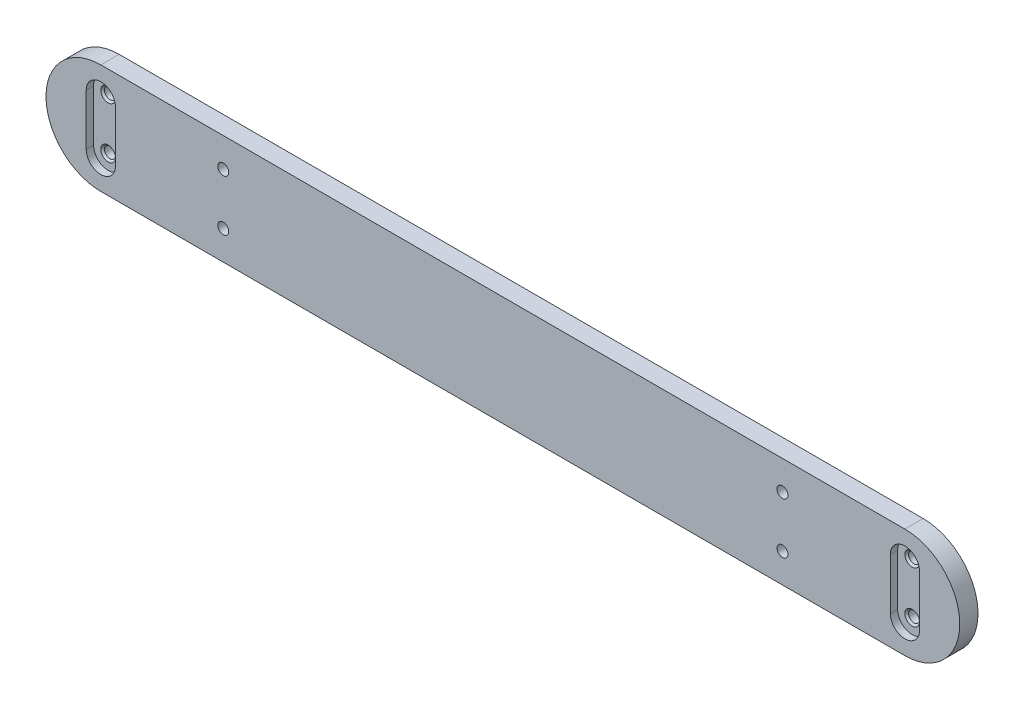
ISO-10303-21;
HEADER;
FILE_DESCRIPTION(('STEP AP214'),'2;1');
FILE_NAME('part.step','',(''),(''),'','','');
FILE_SCHEMA(('AUTOMOTIVE_DESIGN { 1 0 10303 214 1 1 1 1 }'));
ENDSEC;
DATA;
#1=APPLICATION_CONTEXT('core data for automotive mechanical design processes');
#2=APPLICATION_PROTOCOL_DEFINITION('international standard','automotive_design',2000,#1);
#3=PRODUCT_CONTEXT('',#1,'mechanical');
#4=PRODUCT('Part','Part','',(#3));
#5=PRODUCT_RELATED_PRODUCT_CATEGORY('part','',(#4));
#6=PRODUCT_DEFINITION_FORMATION('','',#4);
#7=PRODUCT_DEFINITION_CONTEXT('part definition',#1,'design');
#8=PRODUCT_DEFINITION('design','',#6,#7);
#9=PRODUCT_DEFINITION_SHAPE('','',#8);
#10=(LENGTH_UNIT() NAMED_UNIT(*) SI_UNIT(.MILLI.,.METRE.));
#11=(NAMED_UNIT(*) PLANE_ANGLE_UNIT() SI_UNIT($,.RADIAN.));
#12=(NAMED_UNIT(*) SI_UNIT($,.STERADIAN.) SOLID_ANGLE_UNIT());
#13=UNCERTAINTY_MEASURE_WITH_UNIT(LENGTH_MEASURE(1.E-05),#10,'distance_accuracy_value','');
#14=(GEOMETRIC_REPRESENTATION_CONTEXT(3) GLOBAL_UNCERTAINTY_ASSIGNED_CONTEXT((#13)) GLOBAL_UNIT_ASSIGNED_CONTEXT((#10,
#11,#12)) REPRESENTATION_CONTEXT('',''));
#15=CARTESIAN_POINT('',(0.,0.,0.));
#16=DIRECTION('',(0.,0.,1.));
#17=DIRECTION('',(1.,0.,0.));
#18=AXIS2_PLACEMENT_3D('',#15,#16,#17);
#19=CARTESIAN_POINT('',(-110.,0.,5.));
#20=DIRECTION('',(0.,0.,-1.));
#21=DIRECTION('',(-1.,0.,0.));
#22=AXIS2_PLACEMENT_3D('',#19,#20,#21);
#23=CYLINDRICAL_SURFACE('',#22,15.);
#24=CARTESIAN_POINT('',(-110.,0.,0.));
#25=DIRECTION('',(0.,0.,1.));
#26=DIRECTION('',(1.,0.,0.));
#27=AXIS2_PLACEMENT_3D('',#24,#25,#26);
#28=CIRCLE('',#27,15.);
#29=CARTESIAN_POINT('',(-110.,15.,0.));
#30=VERTEX_POINT('',#29);
#31=CARTESIAN_POINT('',(-110.,-15.,0.));
#32=VERTEX_POINT('',#31);
#33=EDGE_CURVE('E280',#30,#32,#28,.T.);
#34=ORIENTED_EDGE('',*,*,#33,.T.);
#35=DIRECTION('',(0.,0.,-1.));
#36=VECTOR('',#35,1.);
#37=CARTESIAN_POINT('',(-110.,-15.,5.));
#38=LINE('',#37,#36);
#39=CARTESIAN_POINT('',(-110.,-15.,5.));
#40=VERTEX_POINT('',#39);
#41=EDGE_CURVE('E343',#40,#32,#38,.T.);
#42=ORIENTED_EDGE('',*,*,#41,.F.);
#43=CARTESIAN_POINT('',(-110.,0.,5.));
#44=DIRECTION('',(0.,0.,1.));
#45=DIRECTION('',(1.,0.,0.));
#46=AXIS2_PLACEMENT_3D('',#43,#44,#45);
#47=CIRCLE('',#46,15.);
#48=CARTESIAN_POINT('',(-110.,15.,5.));
#49=VERTEX_POINT('',#48);
#50=EDGE_CURVE('E317',#49,#40,#47,.T.);
#51=ORIENTED_EDGE('',*,*,#50,.F.);
#52=DIRECTION('',(0.,0.,-1.));
#53=VECTOR('',#52,1.);
#54=CARTESIAN_POINT('',(-110.,15.,5.));
#55=LINE('',#54,#53);
#56=EDGE_CURVE('E327',#49,#30,#55,.T.);
#57=ORIENTED_EDGE('',*,*,#56,.T.);
#58=EDGE_LOOP('',(#34,#42,#51,#57));
#59=FACE_BOUND('',#58,.T.);
#60=ADVANCED_FACE('F43',(#59),#23,.T.);
#61=CARTESIAN_POINT('',(-110.,-15.,5.));
#62=DIRECTION('',(0.,1.,0.));
#63=DIRECTION('',(0.,0.,1.));
#64=AXIS2_PLACEMENT_3D('',#61,#62,#63);
#65=PLANE('',#64);
#66=DIRECTION('',(1.,0.,0.));
#67=VECTOR('',#66,1.);
#68=CARTESIAN_POINT('',(-110.,-15.,0.));
#69=LINE('',#68,#67);
#70=CARTESIAN_POINT('',(110.,-15.,0.));
#71=VERTEX_POINT('',#70);
#72=EDGE_CURVE('E330',#32,#71,#69,.T.);
#73=ORIENTED_EDGE('',*,*,#72,.T.);
#74=DIRECTION('',(0.,0.,-1.));
#75=VECTOR('',#74,1.);
#76=CARTESIAN_POINT('',(110.,-15.,5.));
#77=LINE('',#76,#75);
#78=CARTESIAN_POINT('',(110.,-15.,5.));
#79=VERTEX_POINT('',#78);
#80=EDGE_CURVE('E340',#79,#71,#77,.T.);
#81=ORIENTED_EDGE('',*,*,#80,.F.);
#82=DIRECTION('',(1.,0.,0.));
#83=VECTOR('',#82,1.);
#84=CARTESIAN_POINT('',(-110.,-15.,5.));
#85=LINE('',#84,#83);
#86=EDGE_CURVE('E320',#40,#79,#85,.T.);
#87=ORIENTED_EDGE('',*,*,#86,.F.);
#88=ORIENTED_EDGE('',*,*,#41,.T.);
#89=EDGE_LOOP('',(#73,#81,#87,#88));
#90=FACE_BOUND('',#89,.T.);
#91=ADVANCED_FACE('F443',(#90),#65,.F.);
#92=CARTESIAN_POINT('',(110.,0.,5.));
#93=DIRECTION('',(0.,0.,-1.));
#94=DIRECTION('',(-1.,0.,0.));
#95=AXIS2_PLACEMENT_3D('',#92,#93,#94);
#96=CYLINDRICAL_SURFACE('',#95,15.);
#97=CARTESIAN_POINT('',(110.,0.,0.));
#98=DIRECTION('',(0.,0.,1.));
#99=DIRECTION('',(1.,0.,0.));
#100=AXIS2_PLACEMENT_3D('',#97,#98,#99);
#101=CIRCLE('',#100,15.);
#102=CARTESIAN_POINT('',(110.,15.,0.));
#103=VERTEX_POINT('',#102);
#104=EDGE_CURVE('E332',#71,#103,#101,.T.);
#105=ORIENTED_EDGE('',*,*,#104,.T.);
#106=DIRECTION('',(0.,0.,-1.));
#107=VECTOR('',#106,1.);
#108=CARTESIAN_POINT('',(110.,15.,5.));
#109=LINE('',#108,#107);
#110=CARTESIAN_POINT('',(110.,15.,5.));
#111=VERTEX_POINT('',#110);
#112=EDGE_CURVE('E337',#111,#103,#109,.T.);
#113=ORIENTED_EDGE('',*,*,#112,.F.);
#114=CARTESIAN_POINT('',(110.,0.,5.));
#115=DIRECTION('',(0.,0.,1.));
#116=DIRECTION('',(1.,0.,0.));
#117=AXIS2_PLACEMENT_3D('',#114,#115,#116);
#118=CIRCLE('',#117,15.);
#119=EDGE_CURVE('E323',#79,#111,#118,.T.);
#120=ORIENTED_EDGE('',*,*,#119,.F.);
#121=ORIENTED_EDGE('',*,*,#80,.T.);
#122=EDGE_LOOP('',(#105,#113,#120,#121));
#123=FACE_BOUND('',#122,.T.);
#124=ADVANCED_FACE('F440',(#123),#96,.T.);
#125=CARTESIAN_POINT('',(-110.,15.,5.));
#126=DIRECTION('',(0.,-1.,0.));
#127=DIRECTION('',(0.,0.,-1.));
#128=AXIS2_PLACEMENT_3D('',#125,#126,#127);
#129=PLANE('',#128);
#130=DIRECTION('',(-1.,0.,0.));
#131=VECTOR('',#130,1.);
#132=CARTESIAN_POINT('',(-110.,15.,0.));
#133=LINE('',#132,#131);
#134=EDGE_CURVE('E321',#103,#30,#133,.T.);
#135=ORIENTED_EDGE('',*,*,#134,.T.);
#136=ORIENTED_EDGE('',*,*,#56,.F.);
#137=DIRECTION('',(-1.,0.,0.));
#138=VECTOR('',#137,1.);
#139=CARTESIAN_POINT('',(-110.,15.,5.));
#140=LINE('',#139,#138);
#141=EDGE_CURVE('E325',#111,#49,#140,.T.);
#142=ORIENTED_EDGE('',*,*,#141,.F.);
#143=ORIENTED_EDGE('',*,*,#112,.T.);
#144=EDGE_LOOP('',(#135,#136,#142,#143));
#145=FACE_BOUND('',#144,.T.);
#146=ADVANCED_FACE('F436',(#145),#129,.F.);
#147=CARTESIAN_POINT('',(-110.,0.,5.));
#148=DIRECTION('',(0.,0.,1.));
#149=DIRECTION('',(1.,0.,0.));
#150=AXIS2_PLACEMENT_3D('',#147,#148,#149);
#151=PLANE('',#150);
#152=CARTESIAN_POINT('',(-76.5,-7.,5.));
#153=DIRECTION('',(0.,0.,-1.));
#154=DIRECTION('',(1.,0.,0.));
#155=AXIS2_PLACEMENT_3D('',#152,#153,#154);
#156=CIRCLE('',#155,1.5);
#157=CARTESIAN_POINT('',(-75.,-7.,5.));
#158=VERTEX_POINT('',#157);
#159=EDGE_CURVE('E529',#158,#158,#156,.T.);
#160=ORIENTED_EDGE('',*,*,#159,.T.);
#161=EDGE_LOOP('',(#160));
#162=FACE_BOUND('',#161,.T.);
#163=CARTESIAN_POINT('',(76.5,7.,5.));
#164=DIRECTION('',(0.,0.,-1.));
#165=DIRECTION('',(1.,0.,0.));
#166=AXIS2_PLACEMENT_3D('',#163,#164,#165);
#167=CIRCLE('',#166,1.5);
#168=CARTESIAN_POINT('',(78.,7.,5.));
#169=VERTEX_POINT('',#168);
#170=EDGE_CURVE('E525',#169,#169,#167,.T.);
#171=ORIENTED_EDGE('',*,*,#170,.T.);
#172=EDGE_LOOP('',(#171));
#173=FACE_BOUND('',#172,.T.);
#174=CARTESIAN_POINT('',(76.5,-7.,5.));
#175=DIRECTION('',(0.,0.,-1.));
#176=DIRECTION('',(-1.,0.,0.));
#177=AXIS2_PLACEMENT_3D('',#174,#175,#176);
#178=CIRCLE('',#177,1.5);
#179=CARTESIAN_POINT('',(75.,-7.,5.));
#180=VERTEX_POINT('',#179);
#181=EDGE_CURVE('E523',#180,#180,#178,.T.);
#182=ORIENTED_EDGE('',*,*,#181,.T.);
#183=EDGE_LOOP('',(#182));
#184=FACE_BOUND('',#183,.T.);
#185=CARTESIAN_POINT('',(-76.5,7.,5.));
#186=DIRECTION('',(0.,0.,-1.));
#187=DIRECTION('',(-1.,0.,0.));
#188=AXIS2_PLACEMENT_3D('',#185,#186,#187);
#189=CIRCLE('',#188,1.5);
#190=CARTESIAN_POINT('',(-78.,7.,5.));
#191=VERTEX_POINT('',#190);
#192=EDGE_CURVE('E207',#191,#191,#189,.T.);
#193=ORIENTED_EDGE('',*,*,#192,.T.);
#194=EDGE_LOOP('',(#193));
#195=FACE_BOUND('',#194,.T.);
#196=CARTESIAN_POINT('',(110.,7.,5.));
#197=DIRECTION('',(0.,0.,1.));
#198=DIRECTION('',(1.,0.,0.));
#199=AXIS2_PLACEMENT_3D('',#196,#197,#198);
#200=CIRCLE('',#199,4.);
#201=CARTESIAN_POINT('',(114.,7.,5.));
#202=VERTEX_POINT('',#201);
#203=CARTESIAN_POINT('',(106.,7.,5.));
#204=VERTEX_POINT('',#203);
#205=EDGE_CURVE('E267',#202,#204,#200,.T.);
#206=ORIENTED_EDGE('',*,*,#205,.F.);
#207=DIRECTION('',(0.,1.,0.));
#208=VECTOR('',#207,1.);
#209=CARTESIAN_POINT('',(114.,7.,5.));
#210=LINE('',#209,#208);
#211=CARTESIAN_POINT('',(114.,-7.,5.));
#212=VERTEX_POINT('',#211);
#213=EDGE_CURVE('E257',#212,#202,#210,.T.);
#214=ORIENTED_EDGE('',*,*,#213,.F.);
#215=CARTESIAN_POINT('',(110.,-7.,5.));
#216=DIRECTION('',(0.,0.,1.));
#217=DIRECTION('',(1.,0.,0.));
#218=AXIS2_PLACEMENT_3D('',#215,#216,#217);
#219=CIRCLE('',#218,4.);
#220=CARTESIAN_POINT('',(106.,-7.,5.));
#221=VERTEX_POINT('',#220);
#222=EDGE_CURVE('E273',#221,#212,#219,.T.);
#223=ORIENTED_EDGE('',*,*,#222,.F.);
#224=DIRECTION('',(0.,-1.,0.));
#225=VECTOR('',#224,1.);
#226=CARTESIAN_POINT('',(106.,7.,5.));
#227=LINE('',#226,#225);
#228=EDGE_CURVE('E269',#204,#221,#227,.T.);
#229=ORIENTED_EDGE('',*,*,#228,.F.);
#230=EDGE_LOOP('',(#206,#214,#223,#229));
#231=FACE_BOUND('',#230,.T.);
#232=CARTESIAN_POINT('',(-110.,7.,5.));
#233=DIRECTION('',(0.,0.,1.));
#234=DIRECTION('',(1.,0.,0.));
#235=AXIS2_PLACEMENT_3D('',#232,#233,#234);
#236=CIRCLE('',#235,4.);
#237=CARTESIAN_POINT('',(-106.,7.,5.));
#238=VERTEX_POINT('',#237);
#239=CARTESIAN_POINT('',(-114.,7.,5.));
#240=VERTEX_POINT('',#239);
#241=EDGE_CURVE('E220',#238,#240,#236,.T.);
#242=ORIENTED_EDGE('',*,*,#241,.F.);
#243=DIRECTION('',(0.,1.,0.));
#244=VECTOR('',#243,1.);
#245=CARTESIAN_POINT('',(-106.,7.,5.));
#246=LINE('',#245,#244);
#247=CARTESIAN_POINT('',(-106.,-7.,5.));
#248=VERTEX_POINT('',#247);
#249=EDGE_CURVE('E291',#248,#238,#246,.T.);
#250=ORIENTED_EDGE('',*,*,#249,.F.);
#251=CARTESIAN_POINT('',(-110.,-7.,5.));
#252=DIRECTION('',(0.,0.,1.));
#253=DIRECTION('',(1.,0.,0.));
#254=AXIS2_PLACEMENT_3D('',#251,#252,#253);
#255=CIRCLE('',#254,4.);
#256=CARTESIAN_POINT('',(-114.,-7.,5.));
#257=VERTEX_POINT('',#256);
#258=EDGE_CURVE('E305',#257,#248,#255,.T.);
#259=ORIENTED_EDGE('',*,*,#258,.F.);
#260=DIRECTION('',(0.,-1.,0.));
#261=VECTOR('',#260,1.);
#262=CARTESIAN_POINT('',(-114.,7.,5.));
#263=LINE('',#262,#261);
#264=EDGE_CURVE('E302',#240,#257,#263,.T.);
#265=ORIENTED_EDGE('',*,*,#264,.F.);
#266=EDGE_LOOP('',(#242,#250,#259,#265));
#267=FACE_BOUND('',#266,.T.);
#268=ORIENTED_EDGE('',*,*,#50,.T.);
#269=ORIENTED_EDGE('',*,*,#86,.T.);
#270=ORIENTED_EDGE('',*,*,#119,.T.);
#271=ORIENTED_EDGE('',*,*,#141,.T.);
#272=EDGE_LOOP('',(#268,#269,#270,#271));
#273=FACE_BOUND('',#272,.T.);
#274=ADVANCED_FACE('F424',(#162,#173,#184,#195,#231,#267,#273),#151,.T.);
#275=CARTESIAN_POINT('',(-110.,0.,0.));
#276=DIRECTION('',(0.,0.,1.));
#277=DIRECTION('',(1.,0.,0.));
#278=AXIS2_PLACEMENT_3D('',#275,#276,#277);
#279=PLANE('',#278);
#280=CARTESIAN_POINT('',(110.,-7.,0.));
#281=DIRECTION('',(0.,0.,1.));
#282=DIRECTION('',(1.,0.,0.));
#283=AXIS2_PLACEMENT_3D('',#280,#281,#282);
#284=CIRCLE('',#283,1.5);
#285=CARTESIAN_POINT('',(111.5,-7.,0.));
#286=VERTEX_POINT('',#285);
#287=EDGE_CURVE('E531',#286,#286,#284,.T.);
#288=ORIENTED_EDGE('',*,*,#287,.T.);
#289=EDGE_LOOP('',(#288));
#290=FACE_BOUND('',#289,.T.);
#291=CARTESIAN_POINT('',(-110.,7.,0.));
#292=DIRECTION('',(0.,0.,1.));
#293=DIRECTION('',(1.,0.,0.));
#294=AXIS2_PLACEMENT_3D('',#291,#292,#293);
#295=CIRCLE('',#294,1.5);
#296=CARTESIAN_POINT('',(-108.5,7.,0.));
#297=VERTEX_POINT('',#296);
#298=EDGE_CURVE('E783',#297,#297,#295,.T.);
#299=ORIENTED_EDGE('',*,*,#298,.T.);
#300=EDGE_LOOP('',(#299));
#301=FACE_BOUND('',#300,.T.);
#302=CARTESIAN_POINT('',(-110.,-7.,0.));
#303=DIRECTION('',(0.,0.,1.));
#304=DIRECTION('',(1.,0.,0.));
#305=AXIS2_PLACEMENT_3D('',#302,#303,#304);
#306=CIRCLE('',#305,1.5);
#307=CARTESIAN_POINT('',(-108.5,-7.,0.));
#308=VERTEX_POINT('',#307);
#309=EDGE_CURVE('E785',#308,#308,#306,.T.);
#310=ORIENTED_EDGE('',*,*,#309,.T.);
#311=EDGE_LOOP('',(#310));
#312=FACE_BOUND('',#311,.T.);
#313=CARTESIAN_POINT('',(110.,7.,0.));
#314=DIRECTION('',(0.,0.,1.));
#315=DIRECTION('',(1.,0.,0.));
#316=AXIS2_PLACEMENT_3D('',#313,#314,#315);
#317=CIRCLE('',#316,1.5);
#318=CARTESIAN_POINT('',(111.5,7.,0.));
#319=VERTEX_POINT('',#318);
#320=EDGE_CURVE('E526',#319,#319,#317,.T.);
#321=ORIENTED_EDGE('',*,*,#320,.T.);
#322=EDGE_LOOP('',(#321));
#323=FACE_BOUND('',#322,.T.);
#324=DIRECTION('',(0.,-1.,0.));
#325=VECTOR('',#324,1.);
#326=CARTESIAN_POINT('',(81.5,7.5,0.));
#327=LINE('',#326,#325);
#328=CARTESIAN_POINT('',(81.5,7.5,0.));
#329=VERTEX_POINT('',#328);
#330=CARTESIAN_POINT('',(81.5,-7.5,0.));
#331=VERTEX_POINT('',#330);
#332=EDGE_CURVE('E213',#329,#331,#327,.T.);
#333=ORIENTED_EDGE('',*,*,#332,.F.);
#334=CARTESIAN_POINT('',(76.5,7.5,0.));
#335=DIRECTION('',(0.,0.,-1.));
#336=DIRECTION('',(-1.,0.,0.));
#337=AXIS2_PLACEMENT_3D('',#334,#335,#336);
#338=CIRCLE('',#337,5.);
#339=CARTESIAN_POINT('',(71.5,7.5,0.));
#340=VERTEX_POINT('',#339);
#341=EDGE_CURVE('E59',#340,#329,#338,.T.);
#342=ORIENTED_EDGE('',*,*,#341,.F.);
#343=DIRECTION('',(0.,1.,0.));
#344=VECTOR('',#343,1.);
#345=CARTESIAN_POINT('',(71.5,7.5,0.));
#346=LINE('',#345,#344);
#347=CARTESIAN_POINT('',(71.5,-7.5,0.));
#348=VERTEX_POINT('',#347);
#349=EDGE_CURVE('E201',#348,#340,#346,.T.);
#350=ORIENTED_EDGE('',*,*,#349,.F.);
#351=CARTESIAN_POINT('',(76.5,-7.5,0.));
#352=DIRECTION('',(0.,0.,-1.));
#353=DIRECTION('',(-1.,0.,0.));
#354=AXIS2_PLACEMENT_3D('',#351,#352,#353);
#355=CIRCLE('',#354,5.);
#356=EDGE_CURVE('E204',#331,#348,#355,.T.);
#357=ORIENTED_EDGE('',*,*,#356,.F.);
#358=EDGE_LOOP('',(#333,#342,#350,#357));
#359=FACE_BOUND('',#358,.T.);
#360=DIRECTION('',(0.,-1.,0.));
#361=VECTOR('',#360,1.);
#362=CARTESIAN_POINT('',(-71.5,7.5,0.));
#363=LINE('',#362,#361);
#364=CARTESIAN_POINT('',(-71.5,7.5,0.));
#365=VERTEX_POINT('',#364);
#366=CARTESIAN_POINT('',(-71.5,-7.5,0.));
#367=VERTEX_POINT('',#366);
#368=EDGE_CURVE('E239',#365,#367,#363,.T.);
#369=ORIENTED_EDGE('',*,*,#368,.F.);
#370=CARTESIAN_POINT('',(-76.5,7.5,0.));
#371=DIRECTION('',(0.,0.,-1.));
#372=DIRECTION('',(1.,0.,0.));
#373=AXIS2_PLACEMENT_3D('',#370,#371,#372);
#374=CIRCLE('',#373,5.);
#375=CARTESIAN_POINT('',(-81.5,7.5,0.));
#376=VERTEX_POINT('',#375);
#377=EDGE_CURVE('E67',#376,#365,#374,.T.);
#378=ORIENTED_EDGE('',*,*,#377,.F.);
#379=DIRECTION('',(0.,1.,0.));
#380=VECTOR('',#379,1.);
#381=CARTESIAN_POINT('',(-81.5,7.5,0.));
#382=LINE('',#381,#380);
#383=CARTESIAN_POINT('',(-81.5,-7.5,0.));
#384=VERTEX_POINT('',#383);
#385=EDGE_CURVE('E228',#384,#376,#382,.T.);
#386=ORIENTED_EDGE('',*,*,#385,.F.);
#387=CARTESIAN_POINT('',(-76.5,-7.5,0.));
#388=DIRECTION('',(0.,0.,-1.));
#389=DIRECTION('',(1.,0.,0.));
#390=AXIS2_PLACEMENT_3D('',#387,#388,#389);
#391=CIRCLE('',#390,5.);
#392=EDGE_CURVE('E242',#367,#384,#391,.T.);
#393=ORIENTED_EDGE('',*,*,#392,.F.);
#394=EDGE_LOOP('',(#369,#378,#386,#393));
#395=FACE_BOUND('',#394,.T.);
#396=ORIENTED_EDGE('',*,*,#33,.F.);
#397=ORIENTED_EDGE('',*,*,#134,.F.);
#398=ORIENTED_EDGE('',*,*,#104,.F.);
#399=ORIENTED_EDGE('',*,*,#72,.F.);
#400=EDGE_LOOP('',(#396,#397,#398,#399));
#401=FACE_BOUND('',#400,.T.);
#402=ADVANCED_FACE('F420',(#290,#301,#312,#323,#359,#395,#401),#279,.F.);
#403=CARTESIAN_POINT('',(-110.,7.,3.));
#404=DIRECTION('',(0.,0.,1.));
#405=DIRECTION('',(1.,0.,0.));
#406=AXIS2_PLACEMENT_3D('',#403,#404,#405);
#407=CYLINDRICAL_SURFACE('',#406,4.);
#408=ORIENTED_EDGE('',*,*,#241,.T.);
#409=DIRECTION('',(0.,0.,1.));
#410=VECTOR('',#409,1.);
#411=CARTESIAN_POINT('',(-114.,7.,3.));
#412=LINE('',#411,#410);
#413=CARTESIAN_POINT('',(-114.,7.,3.));
#414=VERTEX_POINT('',#413);
#415=EDGE_CURVE('E300',#414,#240,#412,.T.);
#416=ORIENTED_EDGE('',*,*,#415,.F.);
#417=CARTESIAN_POINT('',(-110.,7.,3.));
#418=DIRECTION('',(0.,0.,1.));
#419=DIRECTION('',(1.,0.,0.));
#420=AXIS2_PLACEMENT_3D('',#417,#418,#419);
#421=CIRCLE('',#420,4.);
#422=CARTESIAN_POINT('',(-106.,7.,3.));
#423=VERTEX_POINT('',#422);
#424=EDGE_CURVE('E287',#423,#414,#421,.T.);
#425=ORIENTED_EDGE('',*,*,#424,.F.);
#426=DIRECTION('',(0.,0.,1.));
#427=VECTOR('',#426,1.);
#428=CARTESIAN_POINT('',(-106.,7.,3.));
#429=LINE('',#428,#427);
#430=EDGE_CURVE('E270',#423,#238,#429,.T.);
#431=ORIENTED_EDGE('',*,*,#430,.T.);
#432=EDGE_LOOP('',(#408,#416,#425,#431));
#433=FACE_BOUND('',#432,.T.);
#434=ADVANCED_FACE('F423',(#433),#407,.F.);
#435=CARTESIAN_POINT('',(-106.,7.,3.));
#436=DIRECTION('',(1.,0.,0.));
#437=DIRECTION('',(0.,0.,-1.));
#438=AXIS2_PLACEMENT_3D('',#435,#436,#437);
#439=PLANE('',#438);
#440=ORIENTED_EDGE('',*,*,#249,.T.);
#441=ORIENTED_EDGE('',*,*,#430,.F.);
#442=DIRECTION('',(0.,1.,0.));
#443=VECTOR('',#442,1.);
#444=CARTESIAN_POINT('',(-106.,7.,3.));
#445=LINE('',#444,#443);
#446=CARTESIAN_POINT('',(-106.,-7.,3.));
#447=VERTEX_POINT('',#446);
#448=EDGE_CURVE('E297',#447,#423,#445,.T.);
#449=ORIENTED_EDGE('',*,*,#448,.F.);
#450=DIRECTION('',(0.,0.,1.));
#451=VECTOR('',#450,1.);
#452=CARTESIAN_POINT('',(-106.,-7.,3.));
#453=LINE('',#452,#451);
#454=EDGE_CURVE('E311',#447,#248,#453,.T.);
#455=ORIENTED_EDGE('',*,*,#454,.T.);
#456=EDGE_LOOP('',(#440,#441,#449,#455));
#457=FACE_BOUND('',#456,.T.);
#458=ADVANCED_FACE('F601',(#457),#439,.F.);
#459=CARTESIAN_POINT('',(-110.,-7.,3.));
#460=DIRECTION('',(0.,0.,1.));
#461=DIRECTION('',(1.,0.,0.));
#462=AXIS2_PLACEMENT_3D('',#459,#460,#461);
#463=CYLINDRICAL_SURFACE('',#462,4.);
#464=ORIENTED_EDGE('',*,*,#258,.T.);
#465=ORIENTED_EDGE('',*,*,#454,.F.);
#466=CARTESIAN_POINT('',(-110.,-7.,3.));
#467=DIRECTION('',(0.,0.,1.));
#468=DIRECTION('',(1.,0.,0.));
#469=AXIS2_PLACEMENT_3D('',#466,#467,#468);
#470=CIRCLE('',#469,4.);
#471=CARTESIAN_POINT('',(-114.,-7.,3.));
#472=VERTEX_POINT('',#471);
#473=EDGE_CURVE('E294',#472,#447,#470,.T.);
#474=ORIENTED_EDGE('',*,*,#473,.F.);
#475=DIRECTION('',(0.,0.,1.));
#476=VECTOR('',#475,1.);
#477=CARTESIAN_POINT('',(-114.,-7.,3.));
#478=LINE('',#477,#476);
#479=EDGE_CURVE('E313',#472,#257,#478,.T.);
#480=ORIENTED_EDGE('',*,*,#479,.T.);
#481=EDGE_LOOP('',(#464,#465,#474,#480));
#482=FACE_BOUND('',#481,.T.);
#483=ADVANCED_FACE('F604',(#482),#463,.F.);
#484=CARTESIAN_POINT('',(-114.,7.,3.));
#485=DIRECTION('',(-1.,0.,0.));
#486=DIRECTION('',(0.,0.,1.));
#487=AXIS2_PLACEMENT_3D('',#484,#485,#486);
#488=PLANE('',#487);
#489=ORIENTED_EDGE('',*,*,#264,.T.);
#490=ORIENTED_EDGE('',*,*,#479,.F.);
#491=DIRECTION('',(0.,-1.,0.));
#492=VECTOR('',#491,1.);
#493=CARTESIAN_POINT('',(-114.,7.,3.));
#494=LINE('',#493,#492);
#495=EDGE_CURVE('E290',#414,#472,#494,.T.);
#496=ORIENTED_EDGE('',*,*,#495,.F.);
#497=ORIENTED_EDGE('',*,*,#415,.T.);
#498=EDGE_LOOP('',(#489,#490,#496,#497));
#499=FACE_BOUND('',#498,.T.);
#500=ADVANCED_FACE('F599',(#499),#488,.F.);
#501=CARTESIAN_POINT('',(-110.,7.,3.));
#502=DIRECTION('',(0.,0.,1.));
#503=DIRECTION('',(1.,0.,0.));
#504=AXIS2_PLACEMENT_3D('',#501,#502,#503);
#505=PLANE('',#504);
#506=CARTESIAN_POINT('',(-110.,-7.,3.));
#507=DIRECTION('',(0.,0.,1.));
#508=DIRECTION('',(1.,0.,0.));
#509=AXIS2_PLACEMENT_3D('',#506,#507,#508);
#510=CIRCLE('',#509,2.);
#511=CARTESIAN_POINT('',(-108.,-7.,3.));
#512=VERTEX_POINT('',#511);
#513=EDGE_CURVE('E352',#512,#512,#510,.F.);
#514=ORIENTED_EDGE('',*,*,#513,.T.);
#515=EDGE_LOOP('',(#514));
#516=FACE_BOUND('',#515,.T.);
#517=CARTESIAN_POINT('',(-110.,7.,3.));
#518=DIRECTION('',(0.,0.,1.));
#519=DIRECTION('',(1.,0.,0.));
#520=AXIS2_PLACEMENT_3D('',#517,#518,#519);
#521=CIRCLE('',#520,2.);
#522=CARTESIAN_POINT('',(-108.,7.,3.));
#523=VERTEX_POINT('',#522);
#524=EDGE_CURVE('E349',#523,#523,#521,.F.);
#525=ORIENTED_EDGE('',*,*,#524,.T.);
#526=EDGE_LOOP('',(#525));
#527=FACE_BOUND('',#526,.T.);
#528=ORIENTED_EDGE('',*,*,#424,.T.);
#529=ORIENTED_EDGE('',*,*,#495,.T.);
#530=ORIENTED_EDGE('',*,*,#473,.T.);
#531=ORIENTED_EDGE('',*,*,#448,.T.);
#532=EDGE_LOOP('',(#528,#529,#530,#531));
#533=FACE_BOUND('',#532,.T.);
#534=ADVANCED_FACE('F595',(#516,#527,#533),#505,.T.);
#535=CARTESIAN_POINT('',(110.,7.,3.));
#536=DIRECTION('',(0.,0.,1.));
#537=DIRECTION('',(1.,0.,0.));
#538=AXIS2_PLACEMENT_3D('',#535,#536,#537);
#539=CYLINDRICAL_SURFACE('',#538,4.);
#540=ORIENTED_EDGE('',*,*,#205,.T.);
#541=DIRECTION('',(0.,0.,1.));
#542=VECTOR('',#541,1.);
#543=CARTESIAN_POINT('',(106.,7.,3.));
#544=LINE('',#543,#542);
#545=CARTESIAN_POINT('',(106.,7.,3.));
#546=VERTEX_POINT('',#545);
#547=EDGE_CURVE('E266',#546,#204,#544,.T.);
#548=ORIENTED_EDGE('',*,*,#547,.F.);
#549=CARTESIAN_POINT('',(110.,7.,3.));
#550=DIRECTION('',(0.,0.,1.));
#551=DIRECTION('',(1.,0.,0.));
#552=AXIS2_PLACEMENT_3D('',#549,#550,#551);
#553=CIRCLE('',#552,4.);
#554=CARTESIAN_POINT('',(114.,7.,3.));
#555=VERTEX_POINT('',#554);
#556=EDGE_CURVE('E253',#555,#546,#553,.T.);
#557=ORIENTED_EDGE('',*,*,#556,.F.);
#558=DIRECTION('',(0.,0.,1.));
#559=VECTOR('',#558,1.);
#560=CARTESIAN_POINT('',(114.,7.,3.));
#561=LINE('',#560,#559);
#562=EDGE_CURVE('E278',#555,#202,#561,.T.);
#563=ORIENTED_EDGE('',*,*,#562,.T.);
#564=EDGE_LOOP('',(#540,#548,#557,#563));
#565=FACE_BOUND('',#564,.T.);
#566=ADVANCED_FACE('F585',(#565),#539,.F.);
#567=CARTESIAN_POINT('',(114.,7.,3.));
#568=DIRECTION('',(1.,0.,0.));
#569=DIRECTION('',(0.,0.,-1.));
#570=AXIS2_PLACEMENT_3D('',#567,#568,#569);
#571=PLANE('',#570);
#572=ORIENTED_EDGE('',*,*,#213,.T.);
#573=ORIENTED_EDGE('',*,*,#562,.F.);
#574=DIRECTION('',(0.,1.,0.));
#575=VECTOR('',#574,1.);
#576=CARTESIAN_POINT('',(114.,7.,3.));
#577=LINE('',#576,#575);
#578=CARTESIAN_POINT('',(114.,-7.,3.));
#579=VERTEX_POINT('',#578);
#580=EDGE_CURVE('E263',#579,#555,#577,.T.);
#581=ORIENTED_EDGE('',*,*,#580,.F.);
#582=DIRECTION('',(0.,0.,1.));
#583=VECTOR('',#582,1.);
#584=CARTESIAN_POINT('',(114.,-7.,3.));
#585=LINE('',#584,#583);
#586=EDGE_CURVE('E281',#579,#212,#585,.T.);
#587=ORIENTED_EDGE('',*,*,#586,.T.);
#588=EDGE_LOOP('',(#572,#573,#581,#587));
#589=FACE_BOUND('',#588,.T.);
#590=ADVANCED_FACE('F581',(#589),#571,.F.);
#591=CARTESIAN_POINT('',(110.,-7.,3.));
#592=DIRECTION('',(0.,0.,1.));
#593=DIRECTION('',(1.,0.,0.));
#594=AXIS2_PLACEMENT_3D('',#591,#592,#593);
#595=CYLINDRICAL_SURFACE('',#594,4.);
#596=ORIENTED_EDGE('',*,*,#222,.T.);
#597=ORIENTED_EDGE('',*,*,#586,.F.);
#598=CARTESIAN_POINT('',(110.,-7.,3.));
#599=DIRECTION('',(0.,0.,1.));
#600=DIRECTION('',(1.,0.,0.));
#601=AXIS2_PLACEMENT_3D('',#598,#599,#600);
#602=CIRCLE('',#601,4.);
#603=CARTESIAN_POINT('',(106.,-7.,3.));
#604=VERTEX_POINT('',#603);
#605=EDGE_CURVE('E260',#604,#579,#602,.T.);
#606=ORIENTED_EDGE('',*,*,#605,.F.);
#607=DIRECTION('',(0.,0.,1.));
#608=VECTOR('',#607,1.);
#609=CARTESIAN_POINT('',(106.,-7.,3.));
#610=LINE('',#609,#608);
#611=EDGE_CURVE('E283',#604,#221,#610,.T.);
#612=ORIENTED_EDGE('',*,*,#611,.T.);
#613=EDGE_LOOP('',(#596,#597,#606,#612));
#614=FACE_BOUND('',#613,.T.);
#615=ADVANCED_FACE('F584',(#614),#595,.F.);
#616=CARTESIAN_POINT('',(106.,7.,3.));
#617=DIRECTION('',(-1.,0.,0.));
#618=DIRECTION('',(0.,0.,1.));
#619=AXIS2_PLACEMENT_3D('',#616,#617,#618);
#620=PLANE('',#619);
#621=ORIENTED_EDGE('',*,*,#228,.T.);
#622=ORIENTED_EDGE('',*,*,#611,.F.);
#623=DIRECTION('',(0.,-1.,0.));
#624=VECTOR('',#623,1.);
#625=CARTESIAN_POINT('',(106.,7.,3.));
#626=LINE('',#625,#624);
#627=EDGE_CURVE('E256',#546,#604,#626,.T.);
#628=ORIENTED_EDGE('',*,*,#627,.F.);
#629=ORIENTED_EDGE('',*,*,#547,.T.);
#630=EDGE_LOOP('',(#621,#622,#628,#629));
#631=FACE_BOUND('',#630,.T.);
#632=ADVANCED_FACE('F579',(#631),#620,.F.);
#633=CARTESIAN_POINT('',(110.,7.,3.));
#634=DIRECTION('',(0.,0.,1.));
#635=DIRECTION('',(1.,0.,0.));
#636=AXIS2_PLACEMENT_3D('',#633,#634,#635);
#637=PLANE('',#636);
#638=CARTESIAN_POINT('',(110.,-7.,3.));
#639=DIRECTION('',(0.,0.,1.));
#640=DIRECTION('',(1.,0.,0.));
#641=AXIS2_PLACEMENT_3D('',#638,#639,#640);
#642=CIRCLE('',#641,2.00000000000006);
#643=CARTESIAN_POINT('',(112.,-7.,3.));
#644=VERTEX_POINT('',#643);
#645=EDGE_CURVE('E364',#644,#644,#642,.F.);
#646=ORIENTED_EDGE('',*,*,#645,.T.);
#647=EDGE_LOOP('',(#646));
#648=FACE_BOUND('',#647,.T.);
#649=CARTESIAN_POINT('',(110.,7.,3.));
#650=DIRECTION('',(0.,0.,1.));
#651=DIRECTION('',(1.,0.,0.));
#652=AXIS2_PLACEMENT_3D('',#649,#650,#651);
#653=CIRCLE('',#652,2.00000000000006);
#654=CARTESIAN_POINT('',(112.,7.,3.));
#655=VERTEX_POINT('',#654);
#656=EDGE_CURVE('E361',#655,#655,#653,.F.);
#657=ORIENTED_EDGE('',*,*,#656,.T.);
#658=EDGE_LOOP('',(#657));
#659=FACE_BOUND('',#658,.T.);
#660=ORIENTED_EDGE('',*,*,#556,.T.);
#661=ORIENTED_EDGE('',*,*,#627,.T.);
#662=ORIENTED_EDGE('',*,*,#605,.T.);
#663=ORIENTED_EDGE('',*,*,#580,.T.);
#664=EDGE_LOOP('',(#660,#661,#662,#663));
#665=FACE_BOUND('',#664,.T.);
#666=ADVANCED_FACE('F576',(#648,#659,#665),#637,.T.);
#667=CARTESIAN_POINT('',(-76.5,7.5,2.));
#668=DIRECTION('',(0.,0.,-1.));
#669=DIRECTION('',(-1.,0.,0.));
#670=AXIS2_PLACEMENT_3D('',#667,#668,#669);
#671=CYLINDRICAL_SURFACE('',#670,5.);
#672=ORIENTED_EDGE('',*,*,#377,.T.);
#673=DIRECTION('',(0.,0.,-1.));
#674=VECTOR('',#673,1.);
#675=CARTESIAN_POINT('',(-71.5,7.5,2.));
#676=LINE('',#675,#674);
#677=CARTESIAN_POINT('',(-71.5,7.5,2.));
#678=VERTEX_POINT('',#677);
#679=EDGE_CURVE('E237',#678,#365,#676,.T.);
#680=ORIENTED_EDGE('',*,*,#679,.F.);
#681=CARTESIAN_POINT('',(-76.5,7.5,2.));
#682=DIRECTION('',(0.,0.,-1.));
#683=DIRECTION('',(1.,0.,0.));
#684=AXIS2_PLACEMENT_3D('',#681,#682,#683);
#685=CIRCLE('',#684,5.);
#686=CARTESIAN_POINT('',(-81.5,7.5,2.));
#687=VERTEX_POINT('',#686);
#688=EDGE_CURVE('E224',#687,#678,#685,.T.);
#689=ORIENTED_EDGE('',*,*,#688,.F.);
#690=DIRECTION('',(0.,0.,-1.));
#691=VECTOR('',#690,1.);
#692=CARTESIAN_POINT('',(-81.5,7.5,2.));
#693=LINE('',#692,#691);
#694=EDGE_CURVE('E214',#687,#376,#693,.T.);
#695=ORIENTED_EDGE('',*,*,#694,.T.);
#696=EDGE_LOOP('',(#672,#680,#689,#695));
#697=FACE_BOUND('',#696,.T.);
#698=ADVANCED_FACE('F409',(#697),#671,.F.);
#699=CARTESIAN_POINT('',(-81.5,7.5,2.));
#700=DIRECTION('',(-1.,0.,0.));
#701=DIRECTION('',(0.,0.,1.));
#702=AXIS2_PLACEMENT_3D('',#699,#700,#701);
#703=PLANE('',#702);
#704=ORIENTED_EDGE('',*,*,#385,.T.);
#705=ORIENTED_EDGE('',*,*,#694,.F.);
#706=DIRECTION('',(0.,1.,0.));
#707=VECTOR('',#706,1.);
#708=CARTESIAN_POINT('',(-81.5,7.5,2.));
#709=LINE('',#708,#707);
#710=CARTESIAN_POINT('',(-81.5,-7.5,2.));
#711=VERTEX_POINT('',#710);
#712=EDGE_CURVE('E234',#711,#687,#709,.T.);
#713=ORIENTED_EDGE('',*,*,#712,.F.);
#714=DIRECTION('',(0.,0.,-1.));
#715=VECTOR('',#714,1.);
#716=CARTESIAN_POINT('',(-81.5,-7.5,2.));
#717=LINE('',#716,#715);
#718=EDGE_CURVE('E248',#711,#384,#717,.T.);
#719=ORIENTED_EDGE('',*,*,#718,.T.);
#720=EDGE_LOOP('',(#704,#705,#713,#719));
#721=FACE_BOUND('',#720,.T.);
#722=ADVANCED_FACE('F417',(#721),#703,.F.);
#723=CARTESIAN_POINT('',(-76.5,-7.5,2.));
#724=DIRECTION('',(0.,0.,-1.));
#725=DIRECTION('',(-1.,0.,0.));
#726=AXIS2_PLACEMENT_3D('',#723,#724,#725);
#727=CYLINDRICAL_SURFACE('',#726,5.);
#728=ORIENTED_EDGE('',*,*,#392,.T.);
#729=ORIENTED_EDGE('',*,*,#718,.F.);
#730=CARTESIAN_POINT('',(-76.5,-7.5,2.));
#731=DIRECTION('',(0.,0.,-1.));
#732=DIRECTION('',(1.,0.,0.));
#733=AXIS2_PLACEMENT_3D('',#730,#731,#732);
#734=CIRCLE('',#733,5.);
#735=CARTESIAN_POINT('',(-71.5,-7.5,2.));
#736=VERTEX_POINT('',#735);
#737=EDGE_CURVE('E231',#736,#711,#734,.T.);
#738=ORIENTED_EDGE('',*,*,#737,.F.);
#739=DIRECTION('',(0.,0.,-1.));
#740=VECTOR('',#739,1.);
#741=CARTESIAN_POINT('',(-71.5,-7.5,2.));
#742=LINE('',#741,#740);
#743=EDGE_CURVE('E250',#736,#367,#742,.T.);
#744=ORIENTED_EDGE('',*,*,#743,.T.);
#745=EDGE_LOOP('',(#728,#729,#738,#744));
#746=FACE_BOUND('',#745,.T.);
#747=ADVANCED_FACE('F415',(#746),#727,.F.);
#748=CARTESIAN_POINT('',(-71.5,7.5,2.));
#749=DIRECTION('',(1.,0.,0.));
#750=DIRECTION('',(0.,0.,-1.));
#751=AXIS2_PLACEMENT_3D('',#748,#749,#750);
#752=PLANE('',#751);
#753=ORIENTED_EDGE('',*,*,#368,.T.);
#754=ORIENTED_EDGE('',*,*,#743,.F.);
#755=DIRECTION('',(0.,-1.,0.));
#756=VECTOR('',#755,1.);
#757=CARTESIAN_POINT('',(-71.5,7.5,2.));
#758=LINE('',#757,#756);
#759=EDGE_CURVE('E227',#678,#736,#758,.T.);
#760=ORIENTED_EDGE('',*,*,#759,.F.);
#761=ORIENTED_EDGE('',*,*,#679,.T.);
#762=EDGE_LOOP('',(#753,#754,#760,#761));
#763=FACE_BOUND('',#762,.T.);
#764=ADVANCED_FACE('F402',(#763),#752,.F.);
#765=CARTESIAN_POINT('',(-76.5,7.5,2.));
#766=DIRECTION('',(0.,0.,1.));
#767=DIRECTION('',(1.,0.,0.));
#768=AXIS2_PLACEMENT_3D('',#765,#766,#767);
#769=PLANE('',#768);
#770=CARTESIAN_POINT('',(-76.5,-7.,2.));
#771=DIRECTION('',(0.,0.,1.));
#772=DIRECTION('',(1.,0.,0.));
#773=AXIS2_PLACEMENT_3D('',#770,#771,#772);
#774=CIRCLE('',#773,2.00000000000003);
#775=CARTESIAN_POINT('',(-74.5,-7.,2.));
#776=VERTEX_POINT('',#775);
#777=EDGE_CURVE('E385',#776,#776,#774,.T.);
#778=ORIENTED_EDGE('',*,*,#777,.T.);
#779=EDGE_LOOP('',(#778));
#780=FACE_BOUND('',#779,.T.);
#781=CARTESIAN_POINT('',(-76.5,7.,2.));
#782=DIRECTION('',(0.,0.,1.));
#783=DIRECTION('',(1.,0.,0.));
#784=AXIS2_PLACEMENT_3D('',#781,#782,#783);
#785=CIRCLE('',#784,2.00000000000003);
#786=CARTESIAN_POINT('',(-74.5,7.,2.));
#787=VERTEX_POINT('',#786);
#788=EDGE_CURVE('E382',#787,#787,#785,.T.);
#789=ORIENTED_EDGE('',*,*,#788,.T.);
#790=EDGE_LOOP('',(#789));
#791=FACE_BOUND('',#790,.T.);
#792=ORIENTED_EDGE('',*,*,#688,.T.);
#793=ORIENTED_EDGE('',*,*,#759,.T.);
#794=ORIENTED_EDGE('',*,*,#737,.T.);
#795=ORIENTED_EDGE('',*,*,#712,.T.);
#796=EDGE_LOOP('',(#792,#793,#794,#795));
#797=FACE_BOUND('',#796,.T.);
#798=ADVANCED_FACE('F399',(#780,#791,#797),#769,.F.);
#799=CARTESIAN_POINT('',(76.5,7.5,2.));
#800=DIRECTION('',(0.,0.,-1.));
#801=DIRECTION('',(-1.,0.,0.));
#802=AXIS2_PLACEMENT_3D('',#799,#800,#801);
#803=CYLINDRICAL_SURFACE('',#802,5.);
#804=ORIENTED_EDGE('',*,*,#341,.T.);
#805=DIRECTION('',(0.,0.,-1.));
#806=VECTOR('',#805,1.);
#807=CARTESIAN_POINT('',(81.5,7.5,2.));
#808=LINE('',#807,#806);
#809=CARTESIAN_POINT('',(81.5,7.5,2.));
#810=VERTEX_POINT('',#809);
#811=EDGE_CURVE('E179',#810,#329,#808,.T.);
#812=ORIENTED_EDGE('',*,*,#811,.F.);
#813=CARTESIAN_POINT('',(76.5,7.5,2.));
#814=DIRECTION('',(0.,0.,-1.));
#815=DIRECTION('',(-1.,0.,0.));
#816=AXIS2_PLACEMENT_3D('',#813,#814,#815);
#817=CIRCLE('',#816,5.);
#818=CARTESIAN_POINT('',(71.5,7.5,2.));
#819=VERTEX_POINT('',#818);
#820=EDGE_CURVE('E183',#819,#810,#817,.T.);
#821=ORIENTED_EDGE('',*,*,#820,.F.);
#822=DIRECTION('',(0.,0.,-1.));
#823=VECTOR('',#822,1.);
#824=CARTESIAN_POINT('',(71.5,7.5,2.));
#825=LINE('',#824,#823);
#826=EDGE_CURVE('E218',#819,#340,#825,.T.);
#827=ORIENTED_EDGE('',*,*,#826,.T.);
#828=EDGE_LOOP('',(#804,#812,#821,#827));
#829=FACE_BOUND('',#828,.T.);
#830=ADVANCED_FACE('F181',(#829),#803,.F.);
#831=CARTESIAN_POINT('',(71.5,7.5,2.));
#832=DIRECTION('',(-1.,0.,0.));
#833=DIRECTION('',(0.,0.,1.));
#834=AXIS2_PLACEMENT_3D('',#831,#832,#833);
#835=PLANE('',#834);
#836=ORIENTED_EDGE('',*,*,#349,.T.);
#837=ORIENTED_EDGE('',*,*,#826,.F.);
#838=DIRECTION('',(0.,1.,0.));
#839=VECTOR('',#838,1.);
#840=CARTESIAN_POINT('',(71.5,7.5,2.));
#841=LINE('',#840,#839);
#842=CARTESIAN_POINT('',(71.5,-7.5,2.));
#843=VERTEX_POINT('',#842);
#844=EDGE_CURVE('E189',#843,#819,#841,.T.);
#845=ORIENTED_EDGE('',*,*,#844,.F.);
#846=DIRECTION('',(0.,0.,-1.));
#847=VECTOR('',#846,1.);
#848=CARTESIAN_POINT('',(71.5,-7.5,2.));
#849=LINE('',#848,#847);
#850=EDGE_CURVE('E221',#843,#348,#849,.T.);
#851=ORIENTED_EDGE('',*,*,#850,.T.);
#852=EDGE_LOOP('',(#836,#837,#845,#851));
#853=FACE_BOUND('',#852,.T.);
#854=ADVANCED_FACE('F557',(#853),#835,.F.);
#855=CARTESIAN_POINT('',(76.5,-7.5,2.));
#856=DIRECTION('',(0.,0.,-1.));
#857=DIRECTION('',(-1.,0.,0.));
#858=AXIS2_PLACEMENT_3D('',#855,#856,#857);
#859=CYLINDRICAL_SURFACE('',#858,5.);
#860=ORIENTED_EDGE('',*,*,#356,.T.);
#861=ORIENTED_EDGE('',*,*,#850,.F.);
#862=CARTESIAN_POINT('',(76.5,-7.5,2.));
#863=DIRECTION('',(0.,0.,-1.));
#864=DIRECTION('',(-1.,0.,0.));
#865=AXIS2_PLACEMENT_3D('',#862,#863,#864);
#866=CIRCLE('',#865,5.);
#867=CARTESIAN_POINT('',(81.5,-7.5,2.));
#868=VERTEX_POINT('',#867);
#869=EDGE_CURVE('E197',#868,#843,#866,.T.);
#870=ORIENTED_EDGE('',*,*,#869,.F.);
#871=DIRECTION('',(0.,0.,-1.));
#872=VECTOR('',#871,1.);
#873=CARTESIAN_POINT('',(81.5,-7.5,2.));
#874=LINE('',#873,#872);
#875=EDGE_CURVE('E188',#868,#331,#874,.T.);
#876=ORIENTED_EDGE('',*,*,#875,.T.);
#877=EDGE_LOOP('',(#860,#861,#870,#876));
#878=FACE_BOUND('',#877,.T.);
#879=ADVANCED_FACE('F560',(#878),#859,.F.);
#880=CARTESIAN_POINT('',(81.5,7.5,2.));
#881=DIRECTION('',(1.,0.,0.));
#882=DIRECTION('',(0.,0.,-1.));
#883=AXIS2_PLACEMENT_3D('',#880,#881,#882);
#884=PLANE('',#883);
#885=ORIENTED_EDGE('',*,*,#332,.T.);
#886=ORIENTED_EDGE('',*,*,#875,.F.);
#887=DIRECTION('',(0.,-1.,0.));
#888=VECTOR('',#887,1.);
#889=CARTESIAN_POINT('',(81.5,7.5,2.));
#890=LINE('',#889,#888);
#891=EDGE_CURVE('E192',#810,#868,#890,.T.);
#892=ORIENTED_EDGE('',*,*,#891,.F.);
#893=ORIENTED_EDGE('',*,*,#811,.T.);
#894=EDGE_LOOP('',(#885,#886,#892,#893));
#895=FACE_BOUND('',#894,.T.);
#896=ADVANCED_FACE('F193',(#895),#884,.F.);
#897=CARTESIAN_POINT('',(76.5,7.5,2.));
#898=DIRECTION('',(0.,0.,-1.));
#899=DIRECTION('',(-1.,0.,0.));
#900=AXIS2_PLACEMENT_3D('',#897,#898,#899);
#901=PLANE('',#900);
#902=CARTESIAN_POINT('',(76.5,7.,2.));
#903=DIRECTION('',(0.,0.,-1.));
#904=DIRECTION('',(-1.,0.,0.));
#905=AXIS2_PLACEMENT_3D('',#902,#903,#904);
#906=CIRCLE('',#905,2.);
#907=CARTESIAN_POINT('',(74.5,7.,2.));
#908=VERTEX_POINT('',#907);
#909=EDGE_CURVE('E376',#908,#908,#906,.F.);
#910=ORIENTED_EDGE('',*,*,#909,.T.);
#911=EDGE_LOOP('',(#910));
#912=FACE_BOUND('',#911,.T.);
#913=CARTESIAN_POINT('',(76.5,-7.,2.));
#914=DIRECTION('',(0.,0.,-1.));
#915=DIRECTION('',(-1.,0.,0.));
#916=AXIS2_PLACEMENT_3D('',#913,#914,#915);
#917=CIRCLE('',#916,2.);
#918=CARTESIAN_POINT('',(74.5,-7.,2.));
#919=VERTEX_POINT('',#918);
#920=EDGE_CURVE('E373',#919,#919,#917,.F.);
#921=ORIENTED_EDGE('',*,*,#920,.T.);
#922=EDGE_LOOP('',(#921));
#923=FACE_BOUND('',#922,.T.);
#924=ORIENTED_EDGE('',*,*,#820,.T.);
#925=ORIENTED_EDGE('',*,*,#891,.T.);
#926=ORIENTED_EDGE('',*,*,#869,.T.);
#927=ORIENTED_EDGE('',*,*,#844,.T.);
#928=EDGE_LOOP('',(#924,#925,#926,#927));
#929=FACE_BOUND('',#928,.T.);
#930=ADVANCED_FACE('F199',(#912,#923,#929),#901,.T.);
#931=CARTESIAN_POINT('',(76.5,-7.,5.));
#932=DIRECTION('',(0.,0.,-1.));
#933=DIRECTION('',(-1.,0.,0.));
#934=AXIS2_PLACEMENT_3D('',#931,#932,#933);
#935=CYLINDRICAL_SURFACE('',#934,1.5);
#936=CARTESIAN_POINT('',(76.5,-7.,2.49999999999998));
#937=DIRECTION('',(0.,0.,-1.));
#938=DIRECTION('',(-1.,0.,0.));
#939=AXIS2_PLACEMENT_3D('',#936,#937,#938);
#940=CIRCLE('',#939,1.5);
#941=CARTESIAN_POINT('',(75.,-7.,2.49999999999998));
#942=VERTEX_POINT('',#941);
#943=EDGE_CURVE('E379',#942,#942,#940,.T.);
#944=ORIENTED_EDGE('',*,*,#943,.T.);
#945=EDGE_LOOP('',(#944));
#946=FACE_BOUND('',#945,.T.);
#947=ORIENTED_EDGE('',*,*,#181,.F.);
#948=EDGE_LOOP('',(#947));
#949=FACE_BOUND('',#948,.T.);
#950=ADVANCED_FACE('F516',(#946,#949),#935,.F.);
#951=CARTESIAN_POINT('',(76.5,7.,5.));
#952=DIRECTION('',(0.,0.,-1.));
#953=DIRECTION('',(-1.,0.,0.));
#954=AXIS2_PLACEMENT_3D('',#951,#952,#953);
#955=CYLINDRICAL_SURFACE('',#954,1.5);
#956=CARTESIAN_POINT('',(76.5,7.,2.49999999999998));
#957=DIRECTION('',(0.,0.,-1.));
#958=DIRECTION('',(-1.,0.,0.));
#959=AXIS2_PLACEMENT_3D('',#956,#957,#958);
#960=CIRCLE('',#959,1.5);
#961=CARTESIAN_POINT('',(75.,7.,2.49999999999998));
#962=VERTEX_POINT('',#961);
#963=EDGE_CURVE('E370',#962,#962,#960,.T.);
#964=ORIENTED_EDGE('',*,*,#963,.T.);
#965=EDGE_LOOP('',(#964));
#966=FACE_BOUND('',#965,.T.);
#967=ORIENTED_EDGE('',*,*,#170,.F.);
#968=EDGE_LOOP('',(#967));
#969=FACE_BOUND('',#968,.T.);
#970=ADVANCED_FACE('F519',(#966,#969),#955,.F.);
#971=CARTESIAN_POINT('',(-76.5,7.,5.));
#972=DIRECTION('',(0.,0.,-1.));
#973=DIRECTION('',(-1.,0.,0.));
#974=AXIS2_PLACEMENT_3D('',#971,#972,#973);
#975=CYLINDRICAL_SURFACE('',#974,1.5);
#976=CARTESIAN_POINT('',(-76.5,7.,2.50000000000001));
#977=DIRECTION('',(0.,0.,1.));
#978=DIRECTION('',(1.,0.,0.));
#979=AXIS2_PLACEMENT_3D('',#976,#977,#978);
#980=CIRCLE('',#979,1.5);
#981=CARTESIAN_POINT('',(-75.,7.,2.50000000000001));
#982=VERTEX_POINT('',#981);
#983=EDGE_CURVE('E11',#982,#982,#980,.F.);
#984=ORIENTED_EDGE('',*,*,#983,.T.);
#985=EDGE_LOOP('',(#984));
#986=FACE_BOUND('',#985,.T.);
#987=ORIENTED_EDGE('',*,*,#192,.F.);
#988=EDGE_LOOP('',(#987));
#989=FACE_BOUND('',#988,.T.);
#990=ADVANCED_FACE('F541',(#986,#989),#975,.F.);
#991=CARTESIAN_POINT('',(-76.5,-7.,5.));
#992=DIRECTION('',(0.,0.,-1.));
#993=DIRECTION('',(-1.,0.,0.));
#994=AXIS2_PLACEMENT_3D('',#991,#992,#993);
#995=CYLINDRICAL_SURFACE('',#994,1.5);
#996=CARTESIAN_POINT('',(-76.5,-7.,2.50000000000001));
#997=DIRECTION('',(0.,0.,1.));
#998=DIRECTION('',(1.,0.,0.));
#999=AXIS2_PLACEMENT_3D('',#996,#997,#998);
#1000=CIRCLE('',#999,1.5);
#1001=CARTESIAN_POINT('',(-75.,-7.,2.50000000000001));
#1002=VERTEX_POINT('',#1001);
#1003=EDGE_CURVE('E52',#1002,#1002,#1000,.F.);
#1004=ORIENTED_EDGE('',*,*,#1003,.T.);
#1005=EDGE_LOOP('',(#1004));
#1006=FACE_BOUND('',#1005,.T.);
#1007=ORIENTED_EDGE('',*,*,#159,.F.);
#1008=EDGE_LOOP('',(#1007));
#1009=FACE_BOUND('',#1008,.T.);
#1010=ADVANCED_FACE('F390',(#1006,#1009),#995,.F.);
#1011=CARTESIAN_POINT('',(110.,7.,0.));
#1012=DIRECTION('',(0.,0.,1.));
#1013=DIRECTION('',(1.,0.,0.));
#1014=AXIS2_PLACEMENT_3D('',#1011,#1012,#1013);
#1015=CYLINDRICAL_SURFACE('',#1014,1.5);
#1016=CARTESIAN_POINT('',(110.,7.,2.49999999999993));
#1017=DIRECTION('',(0.,0.,1.));
#1018=DIRECTION('',(1.,0.,0.));
#1019=AXIS2_PLACEMENT_3D('',#1016,#1017,#1018);
#1020=CIRCLE('',#1019,1.5);
#1021=CARTESIAN_POINT('',(111.5,7.,2.49999999999993));
#1022=VERTEX_POINT('',#1021);
#1023=EDGE_CURVE('E367',#1022,#1022,#1020,.T.);
#1024=ORIENTED_EDGE('',*,*,#1023,.T.);
#1025=EDGE_LOOP('',(#1024));
#1026=FACE_BOUND('',#1025,.T.);
#1027=ORIENTED_EDGE('',*,*,#320,.F.);
#1028=EDGE_LOOP('',(#1027));
#1029=FACE_BOUND('',#1028,.T.);
#1030=ADVANCED_FACE('F549',(#1026,#1029),#1015,.F.);
#1031=CARTESIAN_POINT('',(110.,-7.,0.));
#1032=DIRECTION('',(0.,0.,1.));
#1033=DIRECTION('',(1.,0.,0.));
#1034=AXIS2_PLACEMENT_3D('',#1031,#1032,#1033);
#1035=CYLINDRICAL_SURFACE('',#1034,1.5);
#1036=CARTESIAN_POINT('',(110.,-7.,2.49999999999993));
#1037=DIRECTION('',(0.,0.,1.));
#1038=DIRECTION('',(1.,0.,0.));
#1039=AXIS2_PLACEMENT_3D('',#1036,#1037,#1038);
#1040=CIRCLE('',#1039,1.5);
#1041=CARTESIAN_POINT('',(111.5,-7.,2.49999999999993));
#1042=VERTEX_POINT('',#1041);
#1043=EDGE_CURVE('E358',#1042,#1042,#1040,.T.);
#1044=ORIENTED_EDGE('',*,*,#1043,.T.);
#1045=EDGE_LOOP('',(#1044));
#1046=FACE_BOUND('',#1045,.T.);
#1047=ORIENTED_EDGE('',*,*,#287,.F.);
#1048=EDGE_LOOP('',(#1047));
#1049=FACE_BOUND('',#1048,.T.);
#1050=ADVANCED_FACE('F717',(#1046,#1049),#1035,.F.);
#1051=CARTESIAN_POINT('',(-110.,-7.,0.));
#1052=DIRECTION('',(0.,0.,1.));
#1053=DIRECTION('',(1.,0.,0.));
#1054=AXIS2_PLACEMENT_3D('',#1051,#1052,#1053);
#1055=CYLINDRICAL_SURFACE('',#1054,1.5);
#1056=CARTESIAN_POINT('',(-110.,-7.,2.50000000000002));
#1057=DIRECTION('',(0.,0.,1.));
#1058=DIRECTION('',(1.,0.,0.));
#1059=AXIS2_PLACEMENT_3D('',#1056,#1057,#1058);
#1060=CIRCLE('',#1059,1.5);
#1061=CARTESIAN_POINT('',(-108.5,-7.,2.50000000000002));
#1062=VERTEX_POINT('',#1061);
#1063=EDGE_CURVE('E346',#1062,#1062,#1060,.T.);
#1064=ORIENTED_EDGE('',*,*,#1063,.T.);
#1065=EDGE_LOOP('',(#1064));
#1066=FACE_BOUND('',#1065,.T.);
#1067=ORIENTED_EDGE('',*,*,#309,.F.);
#1068=EDGE_LOOP('',(#1067));
#1069=FACE_BOUND('',#1068,.T.);
#1070=ADVANCED_FACE('F725',(#1066,#1069),#1055,.F.);
#1071=CARTESIAN_POINT('',(-110.,7.,0.));
#1072=DIRECTION('',(0.,0.,1.));
#1073=DIRECTION('',(1.,0.,0.));
#1074=AXIS2_PLACEMENT_3D('',#1071,#1072,#1073);
#1075=CYLINDRICAL_SURFACE('',#1074,1.5);
#1076=CARTESIAN_POINT('',(-110.,7.,2.50000000000002));
#1077=DIRECTION('',(0.,0.,1.));
#1078=DIRECTION('',(1.,0.,0.));
#1079=AXIS2_PLACEMENT_3D('',#1076,#1077,#1078);
#1080=CIRCLE('',#1079,1.5);
#1081=CARTESIAN_POINT('',(-108.5,7.,2.50000000000002));
#1082=VERTEX_POINT('',#1081);
#1083=EDGE_CURVE('E355',#1082,#1082,#1080,.T.);
#1084=ORIENTED_EDGE('',*,*,#1083,.T.);
#1085=EDGE_LOOP('',(#1084));
#1086=FACE_BOUND('',#1085,.T.);
#1087=ORIENTED_EDGE('',*,*,#298,.F.);
#1088=EDGE_LOOP('',(#1087));
#1089=FACE_BOUND('',#1088,.T.);
#1090=ADVANCED_FACE('F472',(#1086,#1089),#1075,.F.);
#1091=CARTESIAN_POINT('',(-110.,-7.,2.50000000000002));
#1092=DIRECTION('',(0.,0.,1.));
#1093=DIRECTION('',(1.,0.,0.));
#1094=AXIS2_PLACEMENT_3D('',#1091,#1092,#1093);
#1095=CONICAL_SURFACE('',#1094,1.5,0.785398163397471);
#1096=ORIENTED_EDGE('',*,*,#513,.F.);
#1097=EDGE_LOOP('',(#1096));
#1098=FACE_BOUND('',#1097,.T.);
#1099=ORIENTED_EDGE('',*,*,#1063,.F.);
#1100=EDGE_LOOP('',(#1099));
#1101=FACE_BOUND('',#1100,.T.);
#1102=ADVANCED_FACE('F465',(#1098,#1101),#1095,.F.);
#1103=CARTESIAN_POINT('',(-110.,7.,2.50000000000002));
#1104=DIRECTION('',(0.,0.,1.));
#1105=DIRECTION('',(1.,0.,0.));
#1106=AXIS2_PLACEMENT_3D('',#1103,#1104,#1105);
#1107=CONICAL_SURFACE('',#1106,1.5,0.785398163397471);
#1108=ORIENTED_EDGE('',*,*,#524,.F.);
#1109=EDGE_LOOP('',(#1108));
#1110=FACE_BOUND('',#1109,.T.);
#1111=ORIENTED_EDGE('',*,*,#1083,.F.);
#1112=EDGE_LOOP('',(#1111));
#1113=FACE_BOUND('',#1112,.T.);
#1114=ADVANCED_FACE('F471',(#1110,#1113),#1107,.F.);
#1115=CARTESIAN_POINT('',(110.,-7.,2.49999999999993));
#1116=DIRECTION('',(0.,0.,1.));
#1117=DIRECTION('',(1.,0.,0.));
#1118=AXIS2_PLACEMENT_3D('',#1115,#1116,#1117);
#1119=CONICAL_SURFACE('',#1118,1.5,0.785398163397443);
#1120=ORIENTED_EDGE('',*,*,#645,.F.);
#1121=EDGE_LOOP('',(#1120));
#1122=FACE_BOUND('',#1121,.T.);
#1123=ORIENTED_EDGE('',*,*,#1043,.F.);
#1124=EDGE_LOOP('',(#1123));
#1125=FACE_BOUND('',#1124,.T.);
#1126=ADVANCED_FACE('F479',(#1122,#1125),#1119,.F.);
#1127=CARTESIAN_POINT('',(110.,7.,2.49999999999993));
#1128=DIRECTION('',(0.,0.,1.));
#1129=DIRECTION('',(1.,0.,0.));
#1130=AXIS2_PLACEMENT_3D('',#1127,#1128,#1129);
#1131=CONICAL_SURFACE('',#1130,1.5,0.785398163397443);
#1132=ORIENTED_EDGE('',*,*,#656,.F.);
#1133=EDGE_LOOP('',(#1132));
#1134=FACE_BOUND('',#1133,.T.);
#1135=ORIENTED_EDGE('',*,*,#1023,.F.);
#1136=EDGE_LOOP('',(#1135));
#1137=FACE_BOUND('',#1136,.T.);
#1138=ADVANCED_FACE('F486',(#1134,#1137),#1131,.F.);
#1139=CARTESIAN_POINT('',(76.5,7.,2.49999999999998));
#1140=DIRECTION('',(0.,0.,-1.));
#1141=DIRECTION('',(-1.,0.,0.));
#1142=AXIS2_PLACEMENT_3D('',#1139,#1140,#1141);
#1143=CONICAL_SURFACE('',#1142,1.5,0.785398163397471);
#1144=ORIENTED_EDGE('',*,*,#909,.F.);
#1145=EDGE_LOOP('',(#1144));
#1146=FACE_BOUND('',#1145,.T.);
#1147=ORIENTED_EDGE('',*,*,#963,.F.);
#1148=EDGE_LOOP('',(#1147));
#1149=FACE_BOUND('',#1148,.T.);
#1150=ADVANCED_FACE('F493',(#1146,#1149),#1143,.F.);
#1151=CARTESIAN_POINT('',(76.5,-7.,2.49999999999998));
#1152=DIRECTION('',(0.,0.,-1.));
#1153=DIRECTION('',(-1.,0.,0.));
#1154=AXIS2_PLACEMENT_3D('',#1151,#1152,#1153);
#1155=CONICAL_SURFACE('',#1154,1.5,0.785398163397471);
#1156=ORIENTED_EDGE('',*,*,#920,.F.);
#1157=EDGE_LOOP('',(#1156));
#1158=FACE_BOUND('',#1157,.T.);
#1159=ORIENTED_EDGE('',*,*,#943,.F.);
#1160=EDGE_LOOP('',(#1159));
#1161=FACE_BOUND('',#1160,.T.);
#1162=ADVANCED_FACE('F396',(#1158,#1161),#1155,.F.);
#1163=CARTESIAN_POINT('',(-76.5,-7.,2.));
#1164=DIRECTION('',(0.,0.,-1.));
#1165=DIRECTION('',(-1.,0.,0.));
#1166=AXIS2_PLACEMENT_3D('',#1163,#1164,#1165);
#1167=CONICAL_SURFACE('',#1166,2.00000000000003,0.785398163397471);
#1168=ORIENTED_EDGE('',*,*,#1003,.F.);
#1169=EDGE_LOOP('',(#1168));
#1170=FACE_BOUND('',#1169,.T.);
#1171=ORIENTED_EDGE('',*,*,#777,.F.);
#1172=EDGE_LOOP('',(#1171));
#1173=FACE_BOUND('',#1172,.T.);
#1174=ADVANCED_FACE('F393',(#1170,#1173),#1167,.F.);
#1175=CARTESIAN_POINT('',(-76.5,7.,2.));
#1176=DIRECTION('',(0.,0.,-1.));
#1177=DIRECTION('',(-1.,0.,0.));
#1178=AXIS2_PLACEMENT_3D('',#1175,#1176,#1177);
#1179=CONICAL_SURFACE('',#1178,2.00000000000003,0.785398163397471);
#1180=ORIENTED_EDGE('',*,*,#983,.F.);
#1181=EDGE_LOOP('',(#1180));
#1182=FACE_BOUND('',#1181,.T.);
#1183=ORIENTED_EDGE('',*,*,#788,.F.);
#1184=EDGE_LOOP('',(#1183));
#1185=FACE_BOUND('',#1184,.T.);
#1186=ADVANCED_FACE('F46',(#1182,#1185),#1179,.F.);
#1187=CLOSED_SHELL('',(#60,#91,#124,#146,#274,#402,#434,#458,#483,#500,#534,#566,#590,#615,#632,
#666,#698,#722,#747,#764,#798,#830,#854,#879,#896,#930,#950,#970,#990,#1010,#1030,#1050,#1070,
#1090,#1102,#1114,#1126,#1138,#1150,#1162,#1174,#1186));
#1188=MANIFOLD_SOLID_BREP('B2',#1187);
#1189=ADVANCED_BREP_SHAPE_REPRESENTATION('',(#18,#1188),#14);
#1190=SHAPE_DEFINITION_REPRESENTATION(#9,#1189);
ENDSEC;
END-ISO-10303-21;
